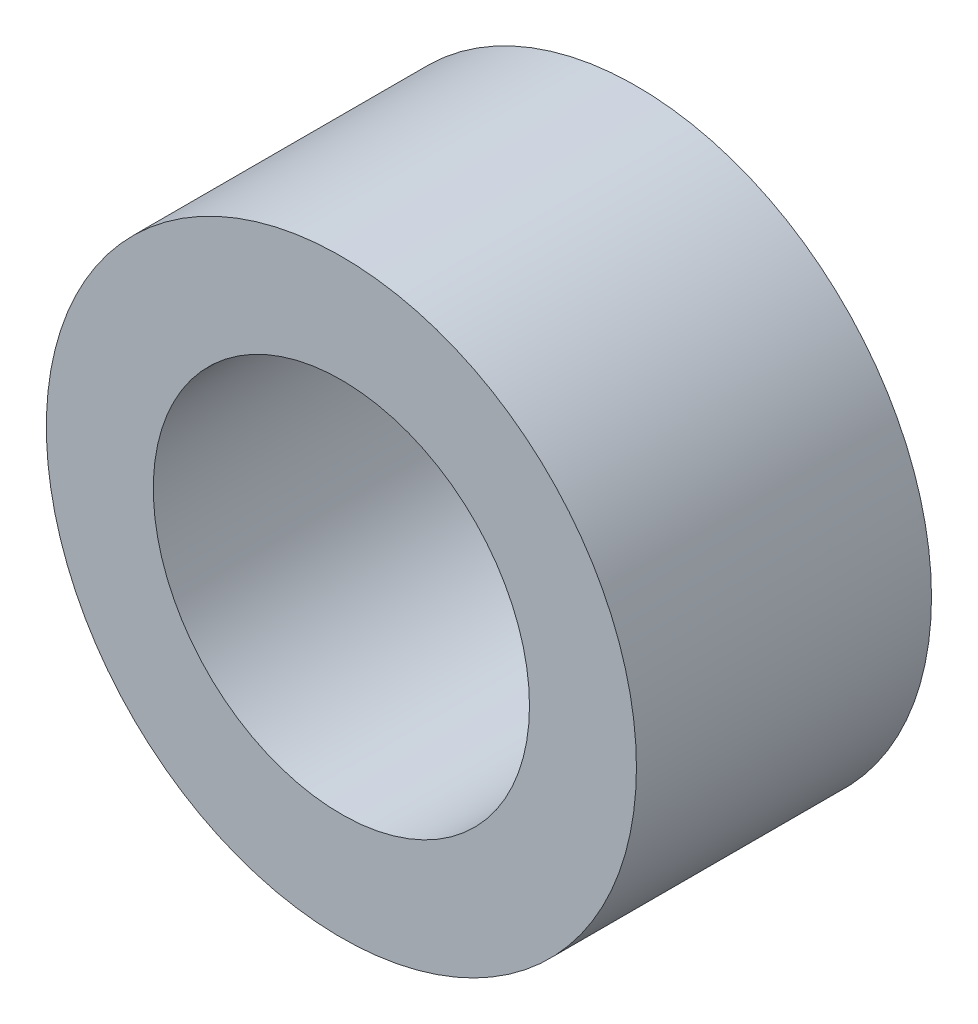
ISO-10303-21;
HEADER;
FILE_DESCRIPTION(('STEP AP214'),'2;1');
FILE_NAME('part.step','',(''),(''),'','','');
FILE_SCHEMA(('AUTOMOTIVE_DESIGN { 1 0 10303 214 1 1 1 1 }'));
ENDSEC;
DATA;
#1=APPLICATION_CONTEXT('core data for automotive mechanical design processes');
#2=APPLICATION_PROTOCOL_DEFINITION('international standard','automotive_design',2000,#1);
#3=PRODUCT_CONTEXT('',#1,'mechanical');
#4=PRODUCT('Part','Part','',(#3));
#5=PRODUCT_RELATED_PRODUCT_CATEGORY('part','',(#4));
#6=PRODUCT_DEFINITION_FORMATION('','',#4);
#7=PRODUCT_DEFINITION_CONTEXT('part definition',#1,'design');
#8=PRODUCT_DEFINITION('design','',#6,#7);
#9=PRODUCT_DEFINITION_SHAPE('','',#8);
#10=(LENGTH_UNIT() NAMED_UNIT(*) SI_UNIT(.MILLI.,.METRE.));
#11=(NAMED_UNIT(*) PLANE_ANGLE_UNIT() SI_UNIT($,.RADIAN.));
#12=(NAMED_UNIT(*) SI_UNIT($,.STERADIAN.) SOLID_ANGLE_UNIT());
#13=UNCERTAINTY_MEASURE_WITH_UNIT(LENGTH_MEASURE(1.E-05),#10,'distance_accuracy_value','');
#14=(GEOMETRIC_REPRESENTATION_CONTEXT(3) GLOBAL_UNCERTAINTY_ASSIGNED_CONTEXT((#13)) GLOBAL_UNIT_ASSIGNED_CONTEXT((#10,
#11,#12)) REPRESENTATION_CONTEXT('',''));
#15=CARTESIAN_POINT('',(0.,0.,0.));
#16=DIRECTION('',(0.,0.,1.));
#17=DIRECTION('',(1.,0.,0.));
#18=AXIS2_PLACEMENT_3D('',#15,#16,#17);
#19=CARTESIAN_POINT('',(0.,0.,0.));
#20=DIRECTION('',(0.,0.,1.));
#21=DIRECTION('',(1.,0.,0.));
#22=AXIS2_PLACEMENT_3D('',#19,#20,#21);
#23=CYLINDRICAL_SURFACE('',#22,2.55);
#24=CARTESIAN_POINT('',(0.,0.,4.));
#25=DIRECTION('',(0.,0.,1.));
#26=DIRECTION('',(1.,0.,0.));
#27=AXIS2_PLACEMENT_3D('',#24,#25,#26);
#28=CIRCLE('',#27,2.55);
#29=CARTESIAN_POINT('',(2.55,0.,4.));
#30=VERTEX_POINT('',#29);
#31=EDGE_CURVE('E22',#30,#30,#28,.T.);
#32=ORIENTED_EDGE('',*,*,#31,.T.);
#33=EDGE_LOOP('',(#32));
#34=FACE_BOUND('',#33,.T.);
#35=CARTESIAN_POINT('',(0.,0.,0.));
#36=DIRECTION('',(0.,0.,1.));
#37=DIRECTION('',(1.,0.,0.));
#38=AXIS2_PLACEMENT_3D('',#35,#36,#37);
#39=CIRCLE('',#38,2.55);
#40=CARTESIAN_POINT('',(2.55,0.,0.));
#41=VERTEX_POINT('',#40);
#42=EDGE_CURVE('E10',#41,#41,#39,.T.);
#43=ORIENTED_EDGE('',*,*,#42,.F.);
#44=EDGE_LOOP('',(#43));
#45=FACE_BOUND('',#44,.T.);
#46=ADVANCED_FACE('F15',(#34,#45),#23,.F.);
#47=CARTESIAN_POINT('',(0.,0.,0.));
#48=DIRECTION('',(0.,0.,1.));
#49=DIRECTION('',(1.,0.,0.));
#50=AXIS2_PLACEMENT_3D('',#47,#48,#49);
#51=PLANE('',#50);
#52=ORIENTED_EDGE('',*,*,#42,.T.);
#53=EDGE_LOOP('',(#52));
#54=FACE_BOUND('',#53,.T.);
#55=CARTESIAN_POINT('',(0.,0.,0.));
#56=DIRECTION('',(0.,0.,1.));
#57=DIRECTION('',(1.,0.,0.));
#58=AXIS2_PLACEMENT_3D('',#55,#56,#57);
#59=CIRCLE('',#58,4.);
#60=CARTESIAN_POINT('',(4.,0.,0.));
#61=VERTEX_POINT('',#60);
#62=EDGE_CURVE('E30',#61,#61,#59,.T.);
#63=ORIENTED_EDGE('',*,*,#62,.F.);
#64=EDGE_LOOP('',(#63));
#65=FACE_BOUND('',#64,.T.);
#66=ADVANCED_FACE('F52',(#54,#65),#51,.F.);
#67=CARTESIAN_POINT('',(0.,0.,4.));
#68=DIRECTION('',(0.,0.,1.));
#69=DIRECTION('',(1.,0.,0.));
#70=AXIS2_PLACEMENT_3D('',#67,#68,#69);
#71=PLANE('',#70);
#72=ORIENTED_EDGE('',*,*,#31,.F.);
#73=EDGE_LOOP('',(#72));
#74=FACE_BOUND('',#73,.T.);
#75=CARTESIAN_POINT('',(0.,0.,4.));
#76=DIRECTION('',(0.,0.,1.));
#77=DIRECTION('',(1.,0.,0.));
#78=AXIS2_PLACEMENT_3D('',#75,#76,#77);
#79=CIRCLE('',#78,4.);
#80=CARTESIAN_POINT('',(4.,0.,4.));
#81=VERTEX_POINT('',#80);
#82=EDGE_CURVE('E36',#81,#81,#79,.T.);
#83=ORIENTED_EDGE('',*,*,#82,.T.);
#84=EDGE_LOOP('',(#83));
#85=FACE_BOUND('',#84,.T.);
#86=ADVANCED_FACE('F44',(#74,#85),#71,.T.);
#87=CARTESIAN_POINT('',(0.,0.,0.));
#88=DIRECTION('',(0.,0.,1.));
#89=DIRECTION('',(1.,0.,0.));
#90=AXIS2_PLACEMENT_3D('',#87,#88,#89);
#91=CYLINDRICAL_SURFACE('',#90,4.);
#92=ORIENTED_EDGE('',*,*,#82,.F.);
#93=EDGE_LOOP('',(#92));
#94=FACE_BOUND('',#93,.T.);
#95=ORIENTED_EDGE('',*,*,#62,.T.);
#96=EDGE_LOOP('',(#95));
#97=FACE_BOUND('',#96,.T.);
#98=ADVANCED_FACE('F46',(#94,#97),#91,.T.);
#99=CLOSED_SHELL('',(#46,#66,#86,#98));
#100=MANIFOLD_SOLID_BREP('B1',#99);
#101=ADVANCED_BREP_SHAPE_REPRESENTATION('',(#18,#100),#14);
#102=SHAPE_DEFINITION_REPRESENTATION(#9,#101);
ENDSEC;
END-ISO-10303-21;
